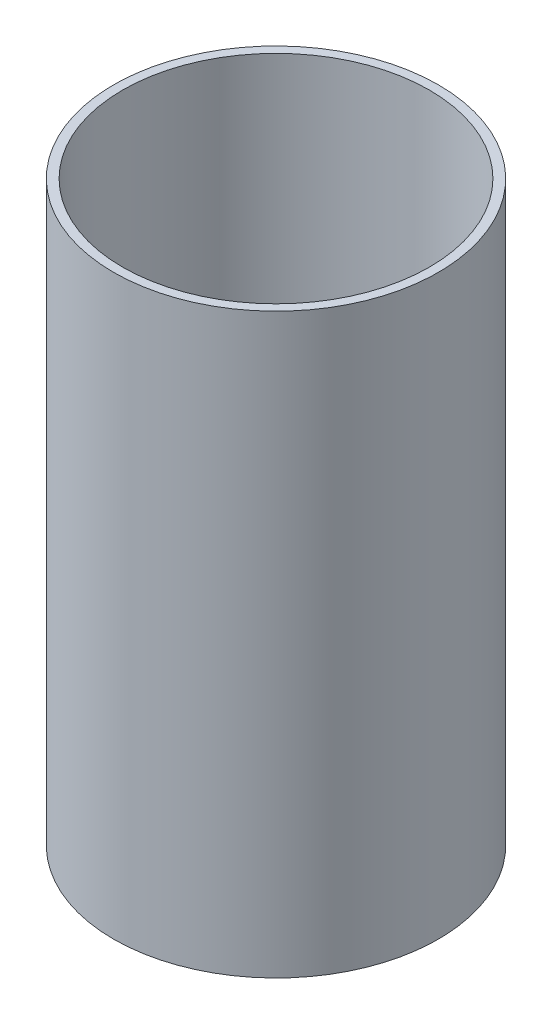
ISO-10303-21;
HEADER;
FILE_DESCRIPTION(('STEP AP214'),'2;1');
FILE_NAME('part.step','',(''),(''),'','','');
FILE_SCHEMA(('AUTOMOTIVE_DESIGN { 1 0 10303 214 1 1 1 1 }'));
ENDSEC;
DATA;
#1=APPLICATION_CONTEXT('core data for automotive mechanical design processes');
#2=APPLICATION_PROTOCOL_DEFINITION('international standard','automotive_design',2000,#1);
#3=PRODUCT_CONTEXT('',#1,'mechanical');
#4=PRODUCT('Part','Part','',(#3));
#5=PRODUCT_RELATED_PRODUCT_CATEGORY('part','',(#4));
#6=PRODUCT_DEFINITION_FORMATION('','',#4);
#7=PRODUCT_DEFINITION_CONTEXT('part definition',#1,'design');
#8=PRODUCT_DEFINITION('design','',#6,#7);
#9=PRODUCT_DEFINITION_SHAPE('','',#8);
#10=(LENGTH_UNIT() NAMED_UNIT(*) SI_UNIT(.MILLI.,.METRE.));
#11=(NAMED_UNIT(*) PLANE_ANGLE_UNIT() SI_UNIT($,.RADIAN.));
#12=(NAMED_UNIT(*) SI_UNIT($,.STERADIAN.) SOLID_ANGLE_UNIT());
#13=UNCERTAINTY_MEASURE_WITH_UNIT(LENGTH_MEASURE(1.E-05),#10,'distance_accuracy_value','');
#14=(GEOMETRIC_REPRESENTATION_CONTEXT(3) GLOBAL_UNCERTAINTY_ASSIGNED_CONTEXT((#13)) GLOBAL_UNIT_ASSIGNED_CONTEXT((#10,
#11,#12)) REPRESENTATION_CONTEXT('',''));
#15=CARTESIAN_POINT('',(0.,0.,0.));
#16=DIRECTION('',(0.,0.,1.));
#17=DIRECTION('',(1.,0.,0.));
#18=AXIS2_PLACEMENT_3D('',#15,#16,#17);
#19=CARTESIAN_POINT('',(0.,101.6,0.));
#20=DIRECTION('',(0.,1.,0.));
#21=DIRECTION('',(0.,0.,1.));
#22=AXIS2_PLACEMENT_3D('',#19,#20,#21);
#23=PLANE('',#22);
#24=CARTESIAN_POINT('',(0.,101.6,0.));
#25=DIRECTION('',(0.,1.,0.));
#26=DIRECTION('',(0.,0.,1.));
#27=AXIS2_PLACEMENT_3D('',#24,#25,#26);
#28=CIRCLE('',#27,28.575);
#29=CARTESIAN_POINT('',(0.,101.6,28.575));
#30=VERTEX_POINT('',#29);
#31=EDGE_CURVE('E10',#30,#30,#28,.T.);
#32=ORIENTED_EDGE('',*,*,#31,.T.);
#33=EDGE_LOOP('',(#32));
#34=FACE_BOUND('',#33,.T.);
#35=CARTESIAN_POINT('',(0.,101.6,0.));
#36=DIRECTION('',(0.,1.,0.));
#37=DIRECTION('',(0.,0.,1.));
#38=AXIS2_PLACEMENT_3D('',#35,#36,#37);
#39=CIRCLE('',#38,26.9875);
#40=CARTESIAN_POINT('',(0.,101.6,26.9875));
#41=VERTEX_POINT('',#40);
#42=EDGE_CURVE('E50',#41,#41,#39,.T.);
#43=ORIENTED_EDGE('',*,*,#42,.F.);
#44=EDGE_LOOP('',(#43));
#45=FACE_BOUND('',#44,.T.);
#46=ADVANCED_FACE('F37',(#34,#45),#23,.T.);
#47=CARTESIAN_POINT('',(0.,0.,0.));
#48=DIRECTION('',(0.,1.,0.));
#49=DIRECTION('',(0.,0.,1.));
#50=AXIS2_PLACEMENT_3D('',#47,#48,#49);
#51=PLANE('',#50);
#52=CARTESIAN_POINT('',(0.,0.,0.));
#53=DIRECTION('',(0.,1.,0.));
#54=DIRECTION('',(0.,0.,1.));
#55=AXIS2_PLACEMENT_3D('',#52,#53,#54);
#56=CIRCLE('',#55,28.575);
#57=CARTESIAN_POINT('',(0.,0.,28.575));
#58=VERTEX_POINT('',#57);
#59=EDGE_CURVE('E41',#58,#58,#56,.T.);
#60=ORIENTED_EDGE('',*,*,#59,.F.);
#61=EDGE_LOOP('',(#60));
#62=FACE_BOUND('',#61,.T.);
#63=CARTESIAN_POINT('',(0.,0.,0.));
#64=DIRECTION('',(0.,1.,0.));
#65=DIRECTION('',(0.,0.,1.));
#66=AXIS2_PLACEMENT_3D('',#63,#64,#65);
#67=CIRCLE('',#66,26.9875);
#68=CARTESIAN_POINT('',(0.,0.,26.9875));
#69=VERTEX_POINT('',#68);
#70=EDGE_CURVE('E52',#69,#69,#67,.T.);
#71=ORIENTED_EDGE('',*,*,#70,.T.);
#72=EDGE_LOOP('',(#71));
#73=FACE_BOUND('',#72,.T.);
#74=ADVANCED_FACE('F64',(#62,#73),#51,.F.);
#75=CARTESIAN_POINT('',(0.,101.6,0.));
#76=DIRECTION('',(0.,-1.,0.));
#77=DIRECTION('',(0.,0.,-1.));
#78=AXIS2_PLACEMENT_3D('',#75,#76,#77);
#79=CYLINDRICAL_SURFACE('',#78,28.575);
#80=ORIENTED_EDGE('',*,*,#31,.F.);
#81=EDGE_LOOP('',(#80));
#82=FACE_BOUND('',#81,.T.);
#83=ORIENTED_EDGE('',*,*,#59,.T.);
#84=EDGE_LOOP('',(#83));
#85=FACE_BOUND('',#84,.T.);
#86=ADVANCED_FACE('F39',(#82,#85),#79,.T.);
#87=CARTESIAN_POINT('',(0.,101.6,0.));
#88=DIRECTION('',(0.,-1.,0.));
#89=DIRECTION('',(0.,0.,-1.));
#90=AXIS2_PLACEMENT_3D('',#87,#88,#89);
#91=CYLINDRICAL_SURFACE('',#90,26.9875);
#92=ORIENTED_EDGE('',*,*,#42,.T.);
#93=EDGE_LOOP('',(#92));
#94=FACE_BOUND('',#93,.T.);
#95=ORIENTED_EDGE('',*,*,#70,.F.);
#96=EDGE_LOOP('',(#95));
#97=FACE_BOUND('',#96,.T.);
#98=ADVANCED_FACE('F60',(#94,#97),#91,.F.);
#99=CLOSED_SHELL('',(#46,#74,#86,#98));
#100=MANIFOLD_SOLID_BREP('B2',#99);
#101=ADVANCED_BREP_SHAPE_REPRESENTATION('',(#18,#100),#14);
#102=SHAPE_DEFINITION_REPRESENTATION(#9,#101);
ENDSEC;
END-ISO-10303-21;
